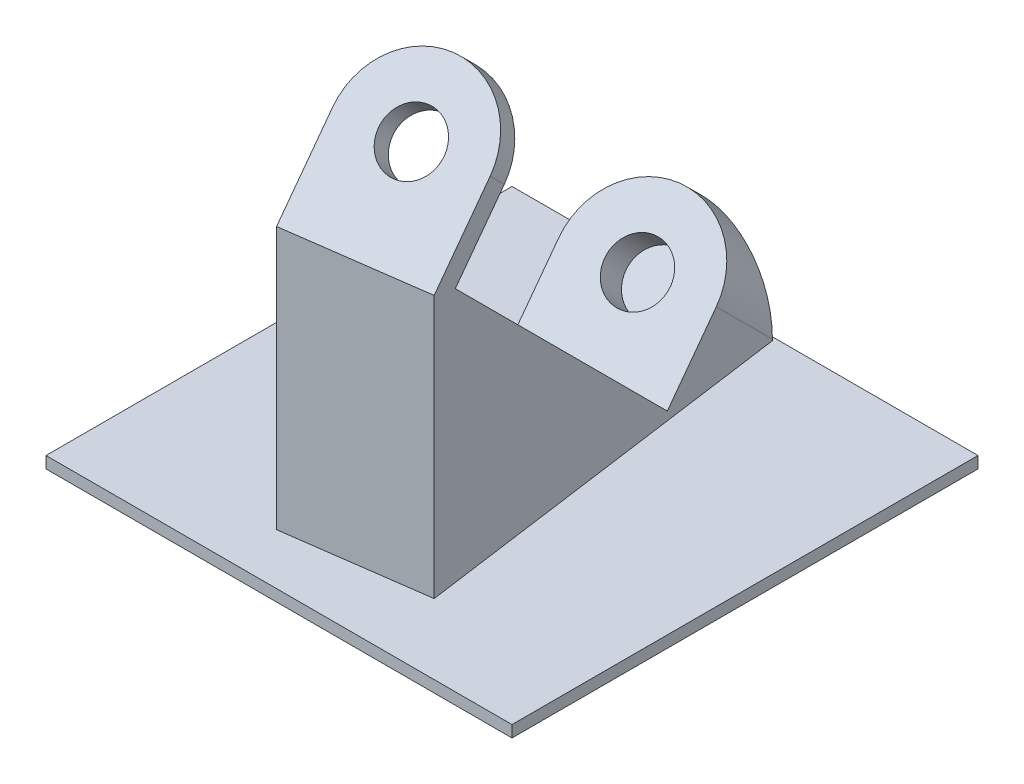
ISO-10303-21;
HEADER;
FILE_DESCRIPTION(('STEP AP214'),'2;1');
FILE_NAME('part.step','',(''),(''),'','','');
FILE_SCHEMA(('AUTOMOTIVE_DESIGN { 1 0 10303 214 1 1 1 1 }'));
ENDSEC;
DATA;
#1=APPLICATION_CONTEXT('core data for automotive mechanical design processes');
#2=APPLICATION_PROTOCOL_DEFINITION('international standard','automotive_design',2000,#1);
#3=PRODUCT_CONTEXT('',#1,'mechanical');
#4=PRODUCT('Part','Part','',(#3));
#5=PRODUCT_RELATED_PRODUCT_CATEGORY('part','',(#4));
#6=PRODUCT_DEFINITION_FORMATION('','',#4);
#7=PRODUCT_DEFINITION_CONTEXT('part definition',#1,'design');
#8=PRODUCT_DEFINITION('design','',#6,#7);
#9=PRODUCT_DEFINITION_SHAPE('','',#8);
#10=(LENGTH_UNIT() NAMED_UNIT(*) SI_UNIT(.MILLI.,.METRE.));
#11=(NAMED_UNIT(*) PLANE_ANGLE_UNIT() SI_UNIT($,.RADIAN.));
#12=(NAMED_UNIT(*) SI_UNIT($,.STERADIAN.) SOLID_ANGLE_UNIT());
#13=UNCERTAINTY_MEASURE_WITH_UNIT(LENGTH_MEASURE(1.E-05),#10,'distance_accuracy_value','');
#14=(GEOMETRIC_REPRESENTATION_CONTEXT(3) GLOBAL_UNCERTAINTY_ASSIGNED_CONTEXT((#13)) GLOBAL_UNIT_ASSIGNED_CONTEXT((#10,
#11,#12)) REPRESENTATION_CONTEXT('',''));
#15=CARTESIAN_POINT('',(0.,0.,0.));
#16=DIRECTION('',(0.,0.,1.));
#17=DIRECTION('',(1.,0.,0.));
#18=AXIS2_PLACEMENT_3D('',#15,#16,#17);
#19=CARTESIAN_POINT('',(98.6752398390647,-16.1808978383713,89.7318150682556));
#20=DIRECTION('',(0.0971690718763255,0.703760673597437,0.703760673644369));
#21=DIRECTION('',(0.,-0.707106781210125,0.70710678116297));
#22=AXIS2_PLACEMENT_3D('',#19,#20,#21);
#23=CYLINDRICAL_SURFACE('',#22,3.);
#24=CARTESIAN_POINT('',(100.13277591721,-5.62448773440971,100.288225172921));
#25=DIRECTION('',(0.0971690718763258,0.703760673597436,0.703760673644369));
#26=DIRECTION('',(0.,-0.707106781210125,0.70710678116297));
#27=AXIS2_PLACEMENT_3D('',#24,#25,#26);
#28=CIRCLE('',#27,3.);
#29=CARTESIAN_POINT('',(97.1609689343316,-5.6244877344097,100.698546091859));
#30=VERTEX_POINT('',#29);
#31=CARTESIAN_POINT('',(103.104582900088,-5.62448773440971,99.8779042539836));
#32=VERTEX_POINT('',#31);
#33=EDGE_CURVE('E590',#30,#32,#28,.F.);
#34=ORIENTED_EDGE('',*,*,#33,.F.);
#35=DIRECTION('',(0.0971690718763257,0.703760673597437,0.703760673644369));
#36=VECTOR('',#35,1.);
#37=CARTESIAN_POINT('',(95.0718338889906,-20.7553422167546,85.5676916085047));
#38=LINE('',#37,#36);
#39=CARTESIAN_POINT('',(97.2581380062079,-4.92072706081226,101.402306765503));
#40=VERTEX_POINT('',#39);
#41=EDGE_CURVE('E184',#30,#40,#38,.T.);
#42=ORIENTED_EDGE('',*,*,#41,.T.);
#43=CARTESIAN_POINT('',(100.229944989086,-4.92072706081226,100.991985846565));
#44=DIRECTION('',(-0.0971690718763257,-0.703760673597437,-0.703760673644369));
#45=DIRECTION('',(0.,-0.707106781210125,0.70710678116297));
#46=AXIS2_PLACEMENT_3D('',#43,#44,#45);
#47=CIRCLE('',#46,3.);
#48=CARTESIAN_POINT('',(103.201751971964,-4.92072706081226,100.581664927628));
#49=VERTEX_POINT('',#48);
#50=EDGE_CURVE('E334',#40,#49,#47,.T.);
#51=ORIENTED_EDGE('',*,*,#50,.T.);
#52=DIRECTION('',(0.0971690718763257,0.703760673597437,0.703760673644369));
#53=VECTOR('',#52,1.);
#54=CARTESIAN_POINT('',(101.015447854747,-20.7553422167546,84.7470497706297));
#55=LINE('',#54,#53);
#56=EDGE_CURVE('E371',#32,#49,#55,.T.);
#57=ORIENTED_EDGE('',*,*,#56,.F.);
#58=EDGE_LOOP('',(#34,#42,#51,#57));
#59=FACE_BOUND('',#58,.T.);
#60=ADVANCED_FACE('F35',(#59),#23,.T.);
#61=CARTESIAN_POINT('',(98.5294862312502,-17.2365388487674,88.676174057789));
#62=DIRECTION('',(0.0971690718763257,0.703760673597437,0.703760673644369));
#63=DIRECTION('',(0.,-0.707106781210125,0.70710678116297));
#64=AXIS2_PLACEMENT_3D('',#61,#62,#63);
#65=CYLINDRICAL_SURFACE('',#64,1.25000000000001);
#66=CARTESIAN_POINT('',(100.13277591721,-5.6244877344097,100.288225172921));
#67=DIRECTION('',(0.0971690718763258,0.703760673597436,0.703760673644369));
#68=DIRECTION('',(0.,-0.707106781210125,0.70710678116297));
#69=AXIS2_PLACEMENT_3D('',#66,#67,#68);
#70=CIRCLE('',#69,1.25000000000001);
#71=CARTESIAN_POINT('',(100.13277591721,-6.50837121092237,101.172108649375));
#72=VERTEX_POINT('',#71);
#73=EDGE_CURVE('E39',#72,#72,#70,.F.);
#74=ORIENTED_EDGE('',*,*,#73,.T.);
#75=EDGE_LOOP('',(#74));
#76=FACE_BOUND('',#75,.T.);
#77=CARTESIAN_POINT('',(100.229944989086,-4.92072706081226,100.991985846565));
#78=DIRECTION('',(0.0971690718763257,0.703760673597437,0.703760673644369));
#79=DIRECTION('',(0.,-0.707106781210125,0.70710678116297));
#80=AXIS2_PLACEMENT_3D('',#77,#78,#79);
#81=CIRCLE('',#80,1.25000000000001);
#82=CARTESIAN_POINT('',(100.229944989086,-5.80461053732492,101.875869323019));
#83=VERTEX_POINT('',#82);
#84=EDGE_CURVE('E376',#83,#83,#81,.T.);
#85=ORIENTED_EDGE('',*,*,#84,.T.);
#86=EDGE_LOOP('',(#85));
#87=FACE_BOUND('',#86,.T.);
#88=ADVANCED_FACE('F275',(#76,#87),#65,.F.);
#89=CARTESIAN_POINT('',(109.938437773457,-19.5320090816046,86.3807038256324));
#90=DIRECTION('',(0.,0.,1.));
#91=DIRECTION('',(1.,0.,0.));
#92=AXIS2_PLACEMENT_3D('',#89,#90,#91);
#93=PLANE('',#92);
#94=CARTESIAN_POINT('',(98.2125479305871,-19.532009080771,86.3807038256324));
#95=DIRECTION('',(0.,0.,1.));
#96=DIRECTION('',(0.136773639654786,0.990602327624755,0.));
#97=AXIS2_PLACEMENT_3D('',#94,#95,#96);
#98=ELLIPSE('',#97,4.2628127889908,3.);
#99=CARTESIAN_POINT('',(101.24032397881,-19.0320090816046,86.3807038256324));
#100=VERTEX_POINT('',#99);
#101=CARTESIAN_POINT('',(101.24100840997,-19.1216881618608,86.3807038256324));
#102=VERTEX_POINT('',#101);
#103=EDGE_CURVE('E52',#100,#102,#98,.F.);
#104=ORIENTED_EDGE('',*,*,#103,.T.);
#105=DIRECTION('',(0.,1.,0.));
#106=VECTOR('',#105,1.);
#107=CARTESIAN_POINT('',(101.24100840997,-19.5320090816046,86.3807038256324));
#108=LINE('',#107,#106);
#109=CARTESIAN_POINT('',(101.24100840997,-19.0320090816046,86.3807038256324));
#110=VERTEX_POINT('',#109);
#111=EDGE_CURVE('E384',#102,#110,#108,.T.);
#112=ORIENTED_EDGE('',*,*,#111,.T.);
#113=DIRECTION('',(1.,0.,0.));
#114=VECTOR('',#113,1.);
#115=CARTESIAN_POINT('',(109.938437773457,-19.0320090816046,86.3807038256324));
#116=LINE('',#115,#114);
#117=CARTESIAN_POINT('',(109.938437773457,-19.0320090816046,86.3807038256324));
#118=VERTEX_POINT('',#117);
#119=EDGE_CURVE('E241',#110,#118,#116,.T.);
#120=ORIENTED_EDGE('',*,*,#119,.T.);
#121=DIRECTION('',(0.,1.,0.));
#122=VECTOR('',#121,1.);
#123=CARTESIAN_POINT('',(109.938437773457,-19.5320090816046,86.3807038256324));
#124=LINE('',#123,#122);
#125=CARTESIAN_POINT('',(109.938437773457,-19.5320090816046,86.3807038256324));
#126=VERTEX_POINT('',#125);
#127=EDGE_CURVE('E44',#126,#118,#124,.T.);
#128=ORIENTED_EDGE('',*,*,#127,.F.);
#129=DIRECTION('',(1.,0.,0.));
#130=VECTOR('',#129,1.);
#131=CARTESIAN_POINT('',(109.938437773457,-19.5320090816046,86.3807038256324));
#132=LINE('',#131,#130);
#133=CARTESIAN_POINT('',(95.1982841004049,-19.5320090816046,86.3807038256324));
#134=VERTEX_POINT('',#133);
#135=EDGE_CURVE('E229',#134,#126,#132,.T.);
#136=ORIENTED_EDGE('',*,*,#135,.F.);
#137=CARTESIAN_POINT('',(98.2125479305871,-19.532009080771,86.3807038256324));
#138=DIRECTION('',(0.,0.,1.));
#139=DIRECTION('',(0.136773639654786,0.990602327624755,0.));
#140=AXIS2_PLACEMENT_3D('',#137,#138,#139);
#141=ELLIPSE('',#140,4.26281278899081,3.);
#142=CARTESIAN_POINT('',(95.2538074759642,-19.0320090816046,86.3807038256324));
#143=VERTEX_POINT('',#142);
#144=EDGE_CURVE('E195',#134,#143,#141,.F.);
#145=ORIENTED_EDGE('',*,*,#144,.T.);
#146=EDGE_CURVE('E246',#143,#100,#116,.T.);
#147=ORIENTED_EDGE('',*,*,#146,.T.);
#148=EDGE_LOOP('',(#104,#112,#120,#128,#136,#145,#147));
#149=FACE_BOUND('',#148,.T.);
#150=ADVANCED_FACE('F269',(#149),#93,.F.);
#151=CARTESIAN_POINT('',(49.9384377734569,-19.0320090816046,48.8807038256324));
#152=DIRECTION('',(0.,-1.,0.));
#153=DIRECTION('',(0.,0.,-1.));
#154=AXIS2_PLACEMENT_3D('',#151,#152,#153);
#155=PLANE('',#154);
#156=DIRECTION('',(-0.990602327625991,0.,0.136773639645836));
#157=VECTOR('',#156,1.);
#158=CARTESIAN_POINT('',(103.586775607034,-19.0320090816046,103.370252773057));
#159=LINE('',#158,#157);
#160=CARTESIAN_POINT('',(103.586775607034,-19.0320090816046,103.370252773057));
#161=VERTEX_POINT('',#160);
#162=CARTESIAN_POINT('',(97.6431616412781,-19.0320090816046,104.190894610932));
#163=VERTEX_POINT('',#162);
#164=EDGE_CURVE('E214',#161,#163,#159,.T.);
#165=ORIENTED_EDGE('',*,*,#164,.T.);
#166=DIRECTION('',(-0.136773639645835,0.,-0.990602327625991));
#167=VECTOR('',#166,1.);
#168=CARTESIAN_POINT('',(97.6431616412781,-19.0320090816046,104.190894610932));
#169=LINE('',#168,#167);
#170=CARTESIAN_POINT('',(95.3174960580078,-19.0320090816046,87.3469344294769));
#171=VERTEX_POINT('',#170);
#172=EDGE_CURVE('E207',#163,#171,#169,.T.);
#173=ORIENTED_EDGE('',*,*,#172,.T.);
#174=DIRECTION('',(-0.990602327625991,0.,0.136773639645836));
#175=VECTOR('',#174,1.);
#176=CARTESIAN_POINT('',(101.261110023764,-19.0320090816046,86.5262925916019));
#177=LINE('',#176,#175);
#178=CARTESIAN_POINT('',(101.261110023764,-19.0320090816046,86.5262925916019));
#179=VERTEX_POINT('',#178);
#180=EDGE_CURVE('E212',#179,#171,#177,.T.);
#181=ORIENTED_EDGE('',*,*,#180,.F.);
#182=DIRECTION('',(-0.136773639645835,0.,-0.990602327625991));
#183=VECTOR('',#182,1.);
#184=CARTESIAN_POINT('',(103.586775607034,-19.0320090816046,103.370252773057));
#185=LINE('',#184,#183);
#186=EDGE_CURVE('E358',#161,#179,#185,.T.);
#187=ORIENTED_EDGE('',*,*,#186,.F.);
#188=EDGE_LOOP('',(#165,#173,#181,#187));
#189=FACE_BOUND('',#188,.T.);
#190=ORIENTED_EDGE('',*,*,#119,.F.);
#191=DIRECTION('',(0.136773639645835,0.,0.990602327625991));
#192=VECTOR('',#191,1.);
#193=CARTESIAN_POINT('',(95.2004790416844,-19.0320090816046,42.6313200422412));
#194=LINE('',#193,#192);
#195=CARTESIAN_POINT('',(101.253390507069,-19.0320090816046,86.4703829058946));
#196=VERTEX_POINT('',#195);
#197=EDGE_CURVE('E381',#110,#196,#194,.T.);
#198=ORIENTED_EDGE('',*,*,#197,.T.);
#199=CARTESIAN_POINT('',(98.2815835241914,-19.0320090816046,86.8807038248321));
#200=DIRECTION('',(0.,-1.,0.));
#201=DIRECTION('',(0.136773639645836,0.,0.990602327625991));
#202=AXIS2_PLACEMENT_3D('',#199,#200,#201);
#203=ELLIPSE('',#202,4.26281278927508,3.);
#204=EDGE_CURVE('E387',#196,#100,#203,.F.);
#205=ORIENTED_EDGE('',*,*,#204,.T.);
#206=ORIENTED_EDGE('',*,*,#146,.F.);
#207=CARTESIAN_POINT('',(98.2815835241914,-19.0320090816046,86.8807038248321));
#208=DIRECTION('',(0.,-1.,0.));
#209=DIRECTION('',(0.136773639645836,0.,0.990602327625991));
#210=AXIS2_PLACEMENT_3D('',#207,#208,#209);
#211=ELLIPSE('',#210,4.26281278927509,3.);
#212=CARTESIAN_POINT('',(95.3097765413134,-19.0320090816046,87.2910247437696));
#213=VERTEX_POINT('',#212);
#214=EDGE_CURVE('E347',#143,#213,#211,.F.);
#215=ORIENTED_EDGE('',*,*,#214,.T.);
#216=DIRECTION('',(-0.136773639645837,0.,-0.990602327625991));
#217=VECTOR('',#216,1.);
#218=CARTESIAN_POINT('',(89.2568650759283,-19.0320090816046,43.4519618801161));
#219=LINE('',#218,#217);
#220=CARTESIAN_POINT('',(95.1840874512042,-19.0320090816046,86.3807038256324));
#221=VERTEX_POINT('',#220);
#222=EDGE_CURVE('E338',#213,#221,#219,.T.);
#223=ORIENTED_EDGE('',*,*,#222,.T.);
#224=CARTESIAN_POINT('',(89.9384377734569,-19.0320090816046,86.3807038256324));
#225=VERTEX_POINT('',#224);
#226=EDGE_CURVE('E242',#225,#221,#116,.T.);
#227=ORIENTED_EDGE('',*,*,#226,.F.);
#228=DIRECTION('',(0.,0.,-1.));
#229=VECTOR('',#228,1.);
#230=CARTESIAN_POINT('',(89.9384377734569,-19.0320090816046,86.3807038256324));
#231=LINE('',#230,#229);
#232=CARTESIAN_POINT('',(89.9384377734569,-19.0320090816046,106.380703825632));
#233=VERTEX_POINT('',#232);
#234=EDGE_CURVE('E225',#233,#225,#231,.T.);
#235=ORIENTED_EDGE('',*,*,#234,.F.);
#236=DIRECTION('',(-1.,0.,0.));
#237=VECTOR('',#236,1.);
#238=CARTESIAN_POINT('',(109.938437773457,-19.0320090816046,106.380703825632));
#239=LINE('',#238,#237);
#240=CARTESIAN_POINT('',(109.938437773457,-19.0320090816046,106.380703825632));
#241=VERTEX_POINT('',#240);
#242=EDGE_CURVE('E230',#241,#233,#239,.T.);
#243=ORIENTED_EDGE('',*,*,#242,.F.);
#244=DIRECTION('',(0.,0.,1.));
#245=VECTOR('',#244,1.);
#246=CARTESIAN_POINT('',(109.938437773457,-19.0320090816046,86.3807038256324));
#247=LINE('',#246,#245);
#248=EDGE_CURVE('E245',#118,#241,#247,.T.);
#249=ORIENTED_EDGE('',*,*,#248,.F.);
#250=EDGE_LOOP('',(#190,#198,#205,#206,#215,#223,#227,#235,#243,#249));
#251=FACE_BOUND('',#250,.T.);
#252=ADVANCED_FACE('F261',(#189,#251),#155,.F.);
#253=CARTESIAN_POINT('',(101.983942502629,-18.6674277899597,91.7615085140685));
#254=DIRECTION('',(-0.0971690718763257,-0.703760673597437,-0.703760673644369));
#255=DIRECTION('',(0.,0.707106781210125,-0.70710678116297));
#256=AXIS2_PLACEMENT_3D('',#253,#254,#255);
#257=PLANE('',#256);
#258=DIRECTION('',(-0.990602327625991,0.,0.136773639645836));
#259=VECTOR('',#258,1.);
#260=CARTESIAN_POINT('',(101.983942502629,-18.6674277899597,91.7615085140685));
#261=LINE('',#260,#259);
#262=CARTESIAN_POINT('',(101.983942502629,-18.6674277899597,91.7615085140685));
#263=VERTEX_POINT('',#262);
#264=CARTESIAN_POINT('',(96.0403285368731,-18.6674277899597,92.5821503519435));
#265=VERTEX_POINT('',#264);
#266=EDGE_CURVE('E223',#263,#265,#261,.T.);
#267=ORIENTED_EDGE('',*,*,#266,.F.);
#268=DIRECTION('',(0.0962559087675262,-0.71043712902528,0.697146961357256));
#269=VECTOR('',#268,1.);
#270=CARTESIAN_POINT('',(101.983942502629,-18.6674277899597,91.7615085140685));
#271=LINE('',#270,#269);
#272=CARTESIAN_POINT('',(101.647046821943,-16.1808978383713,89.3214941493181));
#273=VERTEX_POINT('',#272);
#274=EDGE_CURVE('E170',#273,#263,#271,.T.);
#275=ORIENTED_EDGE('',*,*,#274,.F.);
#276=CARTESIAN_POINT('',(98.6752398390647,-16.1808978383713,89.7318150682556));
#277=DIRECTION('',(-0.0971690718763258,-0.703760673597436,-0.703760673644369));
#278=DIRECTION('',(0.,0.707106781210125,-0.70710678116297));
#279=AXIS2_PLACEMENT_3D('',#276,#277,#278);
#280=CIRCLE('',#279,3.);
#281=CARTESIAN_POINT('',(95.7034328561867,-16.1808978383713,90.1421359871931));
#282=VERTEX_POINT('',#281);
#283=EDGE_CURVE('E162',#273,#282,#280,.F.);
#284=ORIENTED_EDGE('',*,*,#283,.T.);
#285=DIRECTION('',(0.0962559087675262,-0.71043712902528,0.697146961357256));
#286=VECTOR('',#285,1.);
#287=CARTESIAN_POINT('',(96.0403285368731,-18.6674277899597,92.5821503519435));
#288=LINE('',#287,#286);
#289=EDGE_CURVE('E168',#282,#265,#288,.T.);
#290=ORIENTED_EDGE('',*,*,#289,.T.);
#291=EDGE_LOOP('',(#267,#275,#284,#290));
#292=FACE_BOUND('',#291,.T.);
#293=CARTESIAN_POINT('',(98.6752398390647,-16.1808978383713,89.7318150682556));
#294=DIRECTION('',(-0.0971690718763258,-0.703760673597436,-0.703760673644369));
#295=DIRECTION('',(0.,0.707106781210125,-0.70710678116297));
#296=AXIS2_PLACEMENT_3D('',#293,#294,#295);
#297=CIRCLE('',#296,1.25000000000001);
#298=CARTESIAN_POINT('',(98.6752398390647,-15.2970143618586,88.8479315918019));
#299=VERTEX_POINT('',#298);
#300=EDGE_CURVE('E174',#299,#299,#297,.F.);
#301=ORIENTED_EDGE('',*,*,#300,.F.);
#302=EDGE_LOOP('',(#301));
#303=FACE_BOUND('',#302,.T.);
#304=ADVANCED_FACE('F165',(#292,#303),#257,.F.);
#305=CARTESIAN_POINT('',(89.9384377734569,-19.5320090816046,86.3807038256324));
#306=DIRECTION('',(1.,0.,0.));
#307=DIRECTION('',(0.,0.,-1.));
#308=AXIS2_PLACEMENT_3D('',#305,#306,#307);
#309=PLANE('',#308);
#310=ORIENTED_EDGE('',*,*,#234,.T.);
#311=DIRECTION('',(0.,1.,0.));
#312=VECTOR('',#311,1.);
#313=CARTESIAN_POINT('',(89.9384377734569,-19.5320090816046,86.3807038256324));
#314=LINE('',#313,#312);
#315=CARTESIAN_POINT('',(89.9384377734569,-19.5320090816046,86.3807038256324));
#316=VERTEX_POINT('',#315);
#317=EDGE_CURVE('E11',#316,#225,#314,.T.);
#318=ORIENTED_EDGE('',*,*,#317,.F.);
#319=DIRECTION('',(0.,0.,-1.));
#320=VECTOR('',#319,1.);
#321=CARTESIAN_POINT('',(89.9384377734569,-19.5320090816046,86.3807038256324));
#322=LINE('',#321,#320);
#323=CARTESIAN_POINT('',(89.9384377734569,-19.5320090816046,106.380703825632));
#324=VERTEX_POINT('',#323);
#325=EDGE_CURVE('E226',#324,#316,#322,.T.);
#326=ORIENTED_EDGE('',*,*,#325,.F.);
#327=DIRECTION('',(0.,1.,0.));
#328=VECTOR('',#327,1.);
#329=CARTESIAN_POINT('',(89.9384377734569,-19.5320090816046,106.380703825632));
#330=LINE('',#329,#328);
#331=EDGE_CURVE('E238',#324,#233,#330,.T.);
#332=ORIENTED_EDGE('',*,*,#331,.T.);
#333=EDGE_LOOP('',(#310,#318,#326,#332));
#334=FACE_BOUND('',#333,.T.);
#335=ADVANCED_FACE('F37',(#334),#309,.F.);
#336=ORIENTED_EDGE('',*,*,#226,.T.);
#337=DIRECTION('',(0.,-1.,0.));
#338=VECTOR('',#337,1.);
#339=CARTESIAN_POINT('',(95.1840874512042,-19.5320090816046,86.3807038256324));
#340=LINE('',#339,#338);
#341=CARTESIAN_POINT('',(95.1840874512042,-19.5320090816046,86.3807038256324));
#342=VERTEX_POINT('',#341);
#343=EDGE_CURVE('E60',#221,#342,#340,.T.);
#344=ORIENTED_EDGE('',*,*,#343,.T.);
#345=EDGE_CURVE('E231',#316,#342,#132,.T.);
#346=ORIENTED_EDGE('',*,*,#345,.F.);
#347=ORIENTED_EDGE('',*,*,#317,.T.);
#348=EDGE_LOOP('',(#336,#344,#346,#347));
#349=FACE_BOUND('',#348,.T.);
#350=ADVANCED_FACE('F267',(#349),#93,.F.);
#351=CARTESIAN_POINT('',(109.938437773457,-19.5320090816046,86.3807038256324));
#352=DIRECTION('',(-1.,0.,0.));
#353=DIRECTION('',(0.,0.,1.));
#354=AXIS2_PLACEMENT_3D('',#351,#352,#353);
#355=PLANE('',#354);
#356=ORIENTED_EDGE('',*,*,#248,.T.);
#357=DIRECTION('',(0.,1.,0.));
#358=VECTOR('',#357,1.);
#359=CARTESIAN_POINT('',(109.938437773457,-19.5320090816046,106.380703825632));
#360=LINE('',#359,#358);
#361=CARTESIAN_POINT('',(109.938437773457,-19.5320090816046,106.380703825632));
#362=VERTEX_POINT('',#361);
#363=EDGE_CURVE('E251',#362,#241,#360,.T.);
#364=ORIENTED_EDGE('',*,*,#363,.F.);
#365=DIRECTION('',(0.,0.,1.));
#366=VECTOR('',#365,1.);
#367=CARTESIAN_POINT('',(109.938437773457,-19.5320090816046,86.3807038256324));
#368=LINE('',#367,#366);
#369=EDGE_CURVE('E234',#126,#362,#368,.T.);
#370=ORIENTED_EDGE('',*,*,#369,.F.);
#371=ORIENTED_EDGE('',*,*,#127,.T.);
#372=EDGE_LOOP('',(#356,#364,#370,#371));
#373=FACE_BOUND('',#372,.T.);
#374=ADVANCED_FACE('F399',(#373),#355,.F.);
#375=CARTESIAN_POINT('',(109.938437773457,-19.5320090816046,106.380703825632));
#376=DIRECTION('',(0.,0.,-1.));
#377=DIRECTION('',(-1.,0.,0.));
#378=AXIS2_PLACEMENT_3D('',#375,#376,#377);
#379=PLANE('',#378);
#380=ORIENTED_EDGE('',*,*,#242,.T.);
#381=ORIENTED_EDGE('',*,*,#331,.F.);
#382=DIRECTION('',(-1.,0.,0.));
#383=VECTOR('',#382,1.);
#384=CARTESIAN_POINT('',(109.938437773457,-19.5320090816046,106.380703825632));
#385=LINE('',#384,#383);
#386=EDGE_CURVE('E236',#362,#324,#385,.T.);
#387=ORIENTED_EDGE('',*,*,#386,.F.);
#388=ORIENTED_EDGE('',*,*,#363,.T.);
#389=EDGE_LOOP('',(#380,#381,#387,#388));
#390=FACE_BOUND('',#389,.T.);
#391=ADVANCED_FACE('F323',(#390),#379,.F.);
#392=CARTESIAN_POINT('',(49.9384377734569,-19.5320090816046,48.8807038256324));
#393=DIRECTION('',(0.,-1.,0.));
#394=DIRECTION('',(0.,0.,-1.));
#395=AXIS2_PLACEMENT_3D('',#392,#393,#394);
#396=PLANE('',#395);
#397=CARTESIAN_POINT('',(98.212547930472,-19.5320090816046,86.3807038247988));
#398=DIRECTION('',(0.,-1.,0.));
#399=DIRECTION('',(0.136773639645836,0.,0.990602327625991));
#400=AXIS2_PLACEMENT_3D('',#397,#398,#399);
#401=ELLIPSE('',#400,4.26281278927509,3.);
#402=CARTESIAN_POINT('',(95.240740947594,-19.5320090816046,86.7910247437363));
#403=VERTEX_POINT('',#402);
#404=EDGE_CURVE('E191',#134,#403,#401,.F.);
#405=ORIENTED_EDGE('',*,*,#404,.F.);
#406=ORIENTED_EDGE('',*,*,#135,.T.);
#407=ORIENTED_EDGE('',*,*,#369,.T.);
#408=ORIENTED_EDGE('',*,*,#386,.T.);
#409=ORIENTED_EDGE('',*,*,#325,.T.);
#410=ORIENTED_EDGE('',*,*,#345,.T.);
#411=DIRECTION('',(-0.136773639645837,0.,-0.990602327625991));
#412=VECTOR('',#411,1.);
#413=CARTESIAN_POINT('',(89.2568650759283,-19.5320090816046,43.4519618801161));
#414=LINE('',#413,#412);
#415=EDGE_CURVE('E342',#403,#342,#414,.T.);
#416=ORIENTED_EDGE('',*,*,#415,.F.);
#417=EDGE_LOOP('',(#405,#406,#407,#408,#409,#410,#416));
#418=FACE_BOUND('',#417,.T.);
#419=ADVANCED_FACE('F318',(#418),#396,.T.);
#420=CARTESIAN_POINT('',(103.441478580774,-8.11101768599819,102.317918618734));
#421=DIRECTION('',(0.0962559087675263,-0.71043712902528,0.697146961357256));
#422=DIRECTION('',(0.,-0.700399181241864,-0.713751348100813));
#423=AXIS2_PLACEMENT_3D('',#420,#421,#422);
#424=PLANE('',#423);
#425=DIRECTION('',(0.0971690718763254,0.703760673597437,0.703760673644369));
#426=VECTOR('',#425,1.);
#427=CARTESIAN_POINT('',(97.497864615018,-8.11101768599819,103.138560456609));
#428=LINE('',#427,#426);
#429=CARTESIAN_POINT('',(97.497864615018,-8.11101768599819,103.138560456609));
#430=VERTEX_POINT('',#429);
#431=EDGE_CURVE('E189',#265,#430,#428,.T.);
#432=ORIENTED_EDGE('',*,*,#431,.T.);
#433=DIRECTION('',(-0.990602327625991,0.,0.136773639645836));
#434=VECTOR('',#433,1.);
#435=CARTESIAN_POINT('',(103.441478580774,-8.11101768599819,102.317918618734));
#436=LINE('',#435,#434);
#437=CARTESIAN_POINT('',(103.441478580774,-8.11101768599819,102.317918618734));
#438=VERTEX_POINT('',#437);
#439=EDGE_CURVE('E220',#438,#430,#436,.T.);
#440=ORIENTED_EDGE('',*,*,#439,.F.);
#441=DIRECTION('',(0.0971690718763254,0.703760673597437,0.703760673644369));
#442=VECTOR('',#441,1.);
#443=CARTESIAN_POINT('',(103.441478580774,-8.11101768599819,102.317918618734));
#444=LINE('',#443,#442);
#445=EDGE_CURVE('E352',#263,#438,#444,.T.);
#446=ORIENTED_EDGE('',*,*,#445,.F.);
#447=ORIENTED_EDGE('',*,*,#266,.T.);
#448=EDGE_LOOP('',(#432,#440,#446,#447));
#449=FACE_BOUND('',#448,.T.);
#450=ADVANCED_FACE('F315',(#449),#424,.F.);
#451=CARTESIAN_POINT('',(102.815815173785,-3.49317634733387,97.7864633699118));
#452=DIRECTION('',(0.0971690718763257,0.703760673597436,0.703760673644369));
#453=DIRECTION('',(0.,-0.707106781210125,0.70710678116297));
#454=AXIS2_PLACEMENT_3D('',#451,#452,#453);
#455=PLANE('',#454);
#456=DIRECTION('',(-0.0962559087675252,0.71043712902528,-0.697146961357256));
#457=VECTOR('',#456,1.);
#458=CARTESIAN_POINT('',(96.872201208029,-3.49317634733387,98.6071052077868));
#459=LINE('',#458,#457);
#460=EDGE_CURVE('E193',#430,#30,#459,.T.);
#461=ORIENTED_EDGE('',*,*,#460,.T.);
#462=ORIENTED_EDGE('',*,*,#33,.T.);
#463=DIRECTION('',(-0.0962559087675252,0.71043712902528,-0.697146961357256));
#464=VECTOR('',#463,1.);
#465=CARTESIAN_POINT('',(102.815815173785,-3.49317634733387,97.7864633699118));
#466=LINE('',#465,#464);
#467=EDGE_CURVE('E330',#438,#32,#466,.T.);
#468=ORIENTED_EDGE('',*,*,#467,.F.);
#469=ORIENTED_EDGE('',*,*,#439,.T.);
#470=EDGE_LOOP('',(#461,#462,#468,#469));
#471=FACE_BOUND('',#470,.T.);
#472=ORIENTED_EDGE('',*,*,#73,.F.);
#473=EDGE_LOOP('',(#472));
#474=FACE_BOUND('',#473,.T.);
#475=ADVANCED_FACE('F312',(#471,#474),#455,.F.);
#476=CARTESIAN_POINT('',(102.912984245661,-2.78941567373643,98.4902240435562));
#477=DIRECTION('',(-0.0971690718763257,-0.703760673597437,-0.703760673644369));
#478=DIRECTION('',(0.,0.707106781210125,-0.70710678116297));
#479=AXIS2_PLACEMENT_3D('',#476,#477,#478);
#480=PLANE('',#479);
#481=ORIENTED_EDGE('',*,*,#84,.F.);
#482=EDGE_LOOP('',(#481));
#483=FACE_BOUND('',#482,.T.);
#484=DIRECTION('',(0.096255908767527,-0.71043712902528,0.697146961357256));
#485=VECTOR('',#484,1.);
#486=CARTESIAN_POINT('',(102.912984245661,-2.78941567373643,98.4902240435562));
#487=LINE('',#486,#485);
#488=CARTESIAN_POINT('',(103.586775607034,-7.76247557691339,103.370252773057));
#489=VERTEX_POINT('',#488);
#490=EDGE_CURVE('E355',#49,#489,#487,.T.);
#491=ORIENTED_EDGE('',*,*,#490,.F.);
#492=ORIENTED_EDGE('',*,*,#50,.F.);
#493=DIRECTION('',(0.096255908767527,-0.71043712902528,0.697146961357256));
#494=VECTOR('',#493,1.);
#495=CARTESIAN_POINT('',(96.9693702799054,-2.78941567373643,99.3108658814312));
#496=LINE('',#495,#494);
#497=CARTESIAN_POINT('',(97.6431616412781,-7.76247557691339,104.190894610932));
#498=VERTEX_POINT('',#497);
#499=EDGE_CURVE('E202',#40,#498,#496,.T.);
#500=ORIENTED_EDGE('',*,*,#499,.T.);
#501=DIRECTION('',(-0.990602327625991,0.,0.136773639645836));
#502=VECTOR('',#501,1.);
#503=CARTESIAN_POINT('',(103.586775607034,-7.76247557691339,103.370252773057));
#504=LINE('',#503,#502);
#505=EDGE_CURVE('E217',#489,#498,#504,.T.);
#506=ORIENTED_EDGE('',*,*,#505,.F.);
#507=EDGE_LOOP('',(#491,#492,#500,#506));
#508=FACE_BOUND('',#507,.T.);
#509=ADVANCED_FACE('F308',(#483,#508),#480,.F.);
#510=CARTESIAN_POINT('',(103.586775607034,-7.76247557691339,103.370252773057));
#511=DIRECTION('',(-0.136773639645836,0.,-0.990602327625991));
#512=DIRECTION('',(-0.990602327625991,0.,0.136773639645836));
#513=AXIS2_PLACEMENT_3D('',#510,#511,#512);
#514=PLANE('',#513);
#515=DIRECTION('',(0.,-1.,0.));
#516=VECTOR('',#515,1.);
#517=CARTESIAN_POINT('',(97.6431616412781,-7.76247557691339,104.190894610932));
#518=LINE('',#517,#516);
#519=EDGE_CURVE('E204',#498,#163,#518,.T.);
#520=ORIENTED_EDGE('',*,*,#519,.T.);
#521=ORIENTED_EDGE('',*,*,#164,.F.);
#522=DIRECTION('',(0.,-1.,0.));
#523=VECTOR('',#522,1.);
#524=CARTESIAN_POINT('',(103.586775607034,-7.76247557691339,103.370252773057));
#525=LINE('',#524,#523);
#526=EDGE_CURVE('E357',#489,#161,#525,.T.);
#527=ORIENTED_EDGE('',*,*,#526,.F.);
#528=ORIENTED_EDGE('',*,*,#505,.T.);
#529=EDGE_LOOP('',(#520,#521,#527,#528));
#530=FACE_BOUND('',#529,.T.);
#531=ADVANCED_FACE('F304',(#530),#514,.F.);
#532=CARTESIAN_POINT('',(101.261110023764,-19.0320090816046,86.5262925916019));
#533=DIRECTION('',(0.136773639645836,0.,0.990602327625991));
#534=DIRECTION('',(0.990602327625991,0.,-0.136773639645836));
#535=AXIS2_PLACEMENT_3D('',#532,#533,#534);
#536=PLANE('',#535);
#537=CARTESIAN_POINT('',(98.2893030408858,-18.976099395901,86.9366135105394));
#538=DIRECTION('',(0.136773639645836,0.,0.990602327625991));
#539=DIRECTION('',(0.,1.,0.));
#540=AXIS2_PLACEMENT_3D('',#537,#538,#539);
#541=ELLIPSE('',#540,4.22275227100815,3.);
#542=CARTESIAN_POINT('',(95.3174960580078,-18.976099395901,87.3469344294769));
#543=VERTEX_POINT('',#542);
#544=CARTESIAN_POINT('',(101.261110023764,-18.976099395901,86.5262925916019));
#545=VERTEX_POINT('',#544);
#546=EDGE_CURVE('E179',#543,#545,#541,.F.);
#547=ORIENTED_EDGE('',*,*,#546,.T.);
#548=DIRECTION('',(0.,1.,0.));
#549=VECTOR('',#548,1.);
#550=CARTESIAN_POINT('',(101.261110023764,-19.0320090816046,86.5262925916019));
#551=LINE('',#550,#549);
#552=EDGE_CURVE('E198',#179,#545,#551,.T.);
#553=ORIENTED_EDGE('',*,*,#552,.F.);
#554=ORIENTED_EDGE('',*,*,#180,.T.);
#555=DIRECTION('',(0.,1.,0.));
#556=VECTOR('',#555,1.);
#557=CARTESIAN_POINT('',(95.3174960580078,-19.0320090816046,87.3469344294769));
#558=LINE('',#557,#556);
#559=EDGE_CURVE('E210',#171,#543,#558,.T.);
#560=ORIENTED_EDGE('',*,*,#559,.T.);
#561=EDGE_LOOP('',(#547,#553,#554,#560));
#562=FACE_BOUND('',#561,.T.);
#563=ADVANCED_FACE('F299',(#562),#536,.F.);
#564=CARTESIAN_POINT('',(95.2004790416843,-8.03200908160459,42.6313200422412));
#565=DIRECTION('',(0.990602327625991,0.,-0.136773639645835));
#566=DIRECTION('',(-0.136773639645835,0.,-0.990602327625991));
#567=AXIS2_PLACEMENT_3D('',#564,#565,#566);
#568=PLANE('',#567);
#569=ORIENTED_EDGE('',*,*,#56,.T.);
#570=ORIENTED_EDGE('',*,*,#490,.T.);
#571=ORIENTED_EDGE('',*,*,#526,.T.);
#572=ORIENTED_EDGE('',*,*,#186,.T.);
#573=ORIENTED_EDGE('',*,*,#552,.T.);
#574=EDGE_CURVE('E363',#545,#273,#55,.T.);
#575=ORIENTED_EDGE('',*,*,#574,.T.);
#576=ORIENTED_EDGE('',*,*,#274,.T.);
#577=ORIENTED_EDGE('',*,*,#445,.T.);
#578=ORIENTED_EDGE('',*,*,#467,.T.);
#579=EDGE_LOOP('',(#569,#570,#571,#572,#573,#575,#576,#577,#578));
#580=FACE_BOUND('',#579,.T.);
#581=ADVANCED_FACE('F294',(#580),#568,.T.);
#582=CARTESIAN_POINT('',(89.2568650759284,-8.03200908160459,43.4519618801162));
#583=DIRECTION('',(0.990602327625991,0.,-0.136773639645835));
#584=DIRECTION('',(-0.136773639645835,0.,-0.990602327625991));
#585=AXIS2_PLACEMENT_3D('',#582,#583,#584);
#586=PLANE('',#585);
#587=ORIENTED_EDGE('',*,*,#499,.F.);
#588=ORIENTED_EDGE('',*,*,#41,.F.);
#589=ORIENTED_EDGE('',*,*,#460,.F.);
#590=ORIENTED_EDGE('',*,*,#431,.F.);
#591=ORIENTED_EDGE('',*,*,#289,.F.);
#592=EDGE_CURVE('E177',#543,#282,#38,.T.);
#593=ORIENTED_EDGE('',*,*,#592,.F.);
#594=ORIENTED_EDGE('',*,*,#559,.F.);
#595=ORIENTED_EDGE('',*,*,#172,.F.);
#596=ORIENTED_EDGE('',*,*,#519,.F.);
#597=EDGE_LOOP('',(#587,#588,#589,#590,#591,#593,#594,#595,#596));
#598=FACE_BOUND('',#597,.T.);
#599=ADVANCED_FACE('F187',(#598),#586,.F.);
#600=ORIENTED_EDGE('',*,*,#592,.T.);
#601=ORIENTED_EDGE('',*,*,#283,.F.);
#602=ORIENTED_EDGE('',*,*,#574,.F.);
#603=ORIENTED_EDGE('',*,*,#546,.F.);
#604=EDGE_LOOP('',(#600,#601,#602,#603));
#605=FACE_BOUND('',#604,.T.);
#606=ADVANCED_FACE('F178',(#605),#23,.T.);
#607=CARTESIAN_POINT('',(98.0436408718686,-20.7553422167546,85.1573706895672));
#608=DIRECTION('',(0.0971690718763257,0.703760673597437,0.703760673644369));
#609=DIRECTION('',(0.,-0.707106781210125,0.70710678116297));
#610=AXIS2_PLACEMENT_3D('',#607,#608,#609);
#611=CYLINDRICAL_SURFACE('',#610,3.);
#612=ORIENTED_EDGE('',*,*,#404,.T.);
#613=EDGE_CURVE('E183',#403,#213,#38,.T.);
#614=ORIENTED_EDGE('',*,*,#613,.T.);
#615=ORIENTED_EDGE('',*,*,#214,.F.);
#616=ORIENTED_EDGE('',*,*,#144,.F.);
#617=EDGE_LOOP('',(#612,#614,#615,#616));
#618=FACE_BOUND('',#617,.T.);
#619=ADVANCED_FACE('F287',(#618),#611,.T.);
#620=CARTESIAN_POINT('',(95.0718338889906,-20.7553422167546,85.5676916085047));
#621=DIRECTION('',(-0.990602327625991,0.,0.136773639645837));
#622=DIRECTION('',(0.136773639645837,0.,0.990602327625991));
#623=AXIS2_PLACEMENT_3D('',#620,#621,#622);
#624=PLANE('',#623);
#625=ORIENTED_EDGE('',*,*,#415,.T.);
#626=ORIENTED_EDGE('',*,*,#343,.F.);
#627=ORIENTED_EDGE('',*,*,#222,.F.);
#628=ORIENTED_EDGE('',*,*,#613,.F.);
#629=EDGE_LOOP('',(#625,#626,#627,#628));
#630=FACE_BOUND('',#629,.T.);
#631=ADVANCED_FACE('F292',(#630),#624,.F.);
#632=CARTESIAN_POINT('',(98.0436408718686,-20.7553422167546,85.1573706895672));
#633=DIRECTION('',(0.0971690718763257,0.703760673597437,0.703760673644369));
#634=DIRECTION('',(0.,-0.707106781210125,0.70710678116297));
#635=AXIS2_PLACEMENT_3D('',#632,#633,#634);
#636=CYLINDRICAL_SURFACE('',#635,3.);
#637=ORIENTED_EDGE('',*,*,#204,.F.);
#638=EDGE_CURVE('E374',#102,#196,#55,.T.);
#639=ORIENTED_EDGE('',*,*,#638,.F.);
#640=ORIENTED_EDGE('',*,*,#103,.F.);
#641=EDGE_LOOP('',(#637,#639,#640));
#642=FACE_BOUND('',#641,.T.);
#643=ADVANCED_FACE('F522',(#642),#636,.T.);
#644=CARTESIAN_POINT('',(100.726680128444,-18.6240308296787,82.6556088865579));
#645=DIRECTION('',(0.990602327625991,0.,-0.136773639645835));
#646=DIRECTION('',(-0.136773639645835,0.,-0.990602327625991));
#647=AXIS2_PLACEMENT_3D('',#644,#645,#646);
#648=PLANE('',#647);
#649=ORIENTED_EDGE('',*,*,#638,.T.);
#650=ORIENTED_EDGE('',*,*,#197,.F.);
#651=ORIENTED_EDGE('',*,*,#111,.F.);
#652=EDGE_LOOP('',(#649,#650,#651));
#653=FACE_BOUND('',#652,.T.);
#654=ADVANCED_FACE('F530',(#653),#648,.F.);
#655=CARTESIAN_POINT('',(98.5294862312502,-17.2365388487674,88.676174057789));
#656=DIRECTION('',(0.0971690718763257,0.703760673597437,0.703760673644369));
#657=DIRECTION('',(0.,-0.707106781210125,0.70710678116297));
#658=AXIS2_PLACEMENT_3D('',#655,#656,#657);
#659=PLANE('',#658);
#660=CARTESIAN_POINT('',(98.5294862312502,-17.2365388487674,88.676174057789));
#661=DIRECTION('',(0.0971690718763257,0.703760673597437,0.703760673644369));
#662=DIRECTION('',(0.,-0.707106781210125,0.70710678116297));
#663=AXIS2_PLACEMENT_3D('',#660,#661,#662);
#664=CIRCLE('',#663,1.25000000000001);
#665=CARTESIAN_POINT('',(98.5294862312502,-18.1204223252801,89.5600575342427));
#666=VERTEX_POINT('',#665);
#667=EDGE_CURVE('E372',#666,#666,#664,.T.);
#668=ORIENTED_EDGE('',*,*,#667,.T.);
#669=EDGE_LOOP('',(#668));
#670=FACE_BOUND('',#669,.T.);
#671=ADVANCED_FACE('F539',(#670),#659,.T.);
#672=ORIENTED_EDGE('',*,*,#300,.T.);
#673=EDGE_LOOP('',(#672));
#674=FACE_BOUND('',#673,.T.);
#675=ORIENTED_EDGE('',*,*,#667,.F.);
#676=EDGE_LOOP('',(#675));
#677=FACE_BOUND('',#676,.T.);
#678=ADVANCED_FACE('F258',(#674,#677),#65,.F.);
#679=CLOSED_SHELL('',(#60,#88,#150,#252,#304,#335,#350,#374,#391,#419,#450,#475,#509,#531,#563,
#581,#599,#606,#619,#631,#643,#654,#671,#678));
#680=MANIFOLD_SOLID_BREP('B2',#679);
#681=ADVANCED_BREP_SHAPE_REPRESENTATION('',(#18,#680),#14);
#682=SHAPE_DEFINITION_REPRESENTATION(#9,#681);
ENDSEC;
END-ISO-10303-21;
